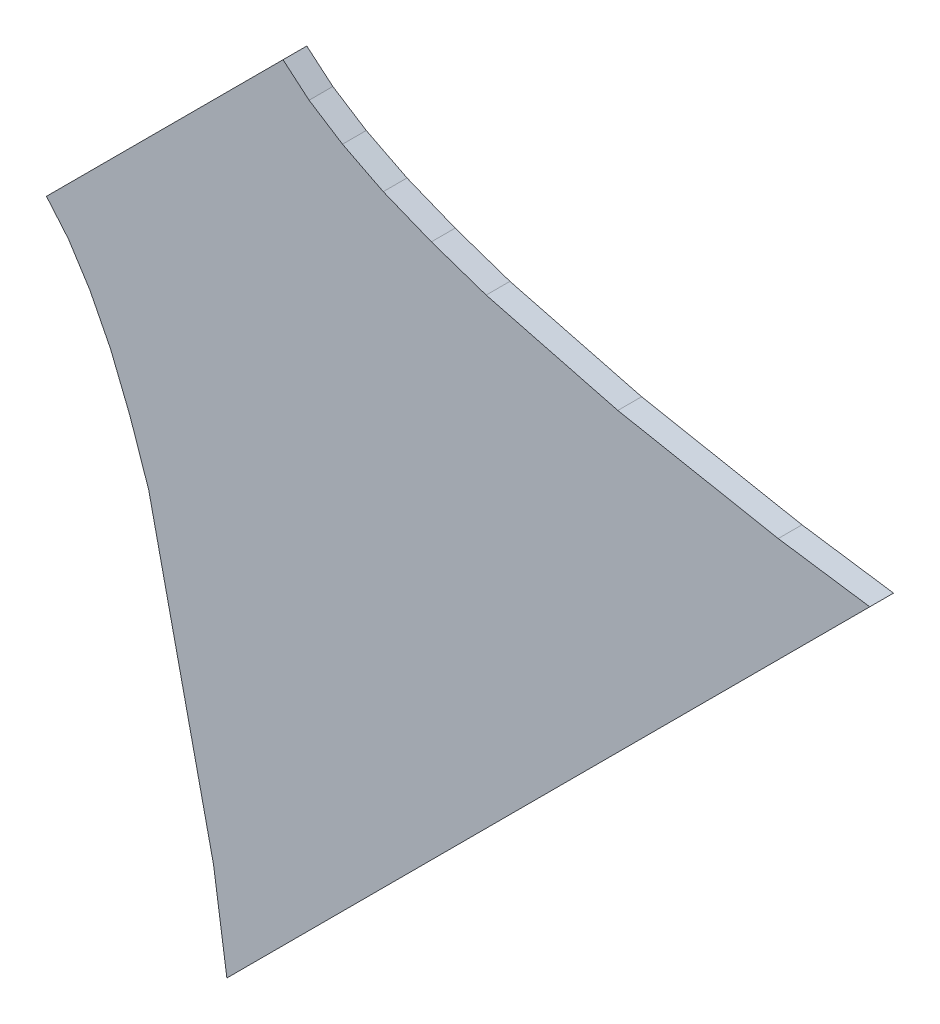
ISO-10303-21;
HEADER;
FILE_DESCRIPTION(('STEP AP214'),'2;1');
FILE_NAME('part.step','',(''),(''),'','','');
FILE_SCHEMA(('AUTOMOTIVE_DESIGN { 1 0 10303 214 1 1 1 1 }'));
ENDSEC;
DATA;
#1=APPLICATION_CONTEXT('core data for automotive mechanical design processes');
#2=APPLICATION_PROTOCOL_DEFINITION('international standard','automotive_design',2000,#1);
#3=PRODUCT_CONTEXT('',#1,'mechanical');
#4=PRODUCT('Part','Part','',(#3));
#5=PRODUCT_RELATED_PRODUCT_CATEGORY('part','',(#4));
#6=PRODUCT_DEFINITION_FORMATION('','',#4);
#7=PRODUCT_DEFINITION_CONTEXT('part definition',#1,'design');
#8=PRODUCT_DEFINITION('design','',#6,#7);
#9=PRODUCT_DEFINITION_SHAPE('','',#8);
#10=(LENGTH_UNIT() NAMED_UNIT(*) SI_UNIT(.MILLI.,.METRE.));
#11=(NAMED_UNIT(*) PLANE_ANGLE_UNIT() SI_UNIT($,.RADIAN.));
#12=(NAMED_UNIT(*) SI_UNIT($,.STERADIAN.) SOLID_ANGLE_UNIT());
#13=UNCERTAINTY_MEASURE_WITH_UNIT(LENGTH_MEASURE(1.E-05),#10,'distance_accuracy_value','');
#14=(GEOMETRIC_REPRESENTATION_CONTEXT(3) GLOBAL_UNCERTAINTY_ASSIGNED_CONTEXT((#13)) GLOBAL_UNIT_ASSIGNED_CONTEXT((#10,
#11,#12)) REPRESENTATION_CONTEXT('',''));
#15=CARTESIAN_POINT('',(0.,0.,0.));
#16=DIRECTION('',(0.,0.,1.));
#17=DIRECTION('',(1.,0.,0.));
#18=AXIS2_PLACEMENT_3D('',#15,#16,#17);
#19=CARTESIAN_POINT('',(44.7480010986328,54.757999420166,0.));
#20=DIRECTION('',(0.76339478271688,0.645932199012131,0.));
#21=DIRECTION('',(0.645932199012131,-0.76339478271688,0.));
#22=AXIS2_PLACEMENT_3D('',#19,#20,#21);
#23=PLANE('',#22);
#24=DIRECTION('',(0.645932199012131,-0.76339478271688,0.));
#25=VECTOR('',#24,1.);
#26=CARTESIAN_POINT('',(44.7480010986328,54.757999420166,0.03556));
#27=LINE('',#26,#25);
#28=CARTESIAN_POINT('',(44.7480010986328,54.757999420166,0.03556));
#29=VERTEX_POINT('',#28);
#30=CARTESIAN_POINT('',(44.7809982299805,54.7190017700195,0.03556));
#31=VERTEX_POINT('',#30);
#32=EDGE_CURVE('E11',#29,#31,#27,.T.);
#33=ORIENTED_EDGE('',*,*,#32,.F.);
#34=DIRECTION('',(0.,0.,1.));
#35=VECTOR('',#34,1.);
#36=CARTESIAN_POINT('',(44.7480010986328,54.757999420166,0.));
#37=LINE('',#36,#35);
#38=CARTESIAN_POINT('',(44.7480010986328,54.757999420166,0.));
#39=VERTEX_POINT('',#38);
#40=EDGE_CURVE('E24',#39,#29,#37,.T.);
#41=ORIENTED_EDGE('',*,*,#40,.F.);
#42=DIRECTION('',(0.645932199012131,-0.76339478271688,0.));
#43=VECTOR('',#42,1.);
#44=CARTESIAN_POINT('',(44.7480010986328,54.757999420166,0.));
#45=LINE('',#44,#43);
#46=CARTESIAN_POINT('',(44.7809982299805,54.7190017700195,0.));
#47=VERTEX_POINT('',#46);
#48=EDGE_CURVE('E154',#39,#47,#45,.T.);
#49=ORIENTED_EDGE('',*,*,#48,.T.);
#50=DIRECTION('',(0.,0.,1.));
#51=VECTOR('',#50,1.);
#52=CARTESIAN_POINT('',(44.7809982299805,54.7190017700195,0.));
#53=LINE('',#52,#51);
#54=EDGE_CURVE('E37',#47,#31,#53,.T.);
#55=ORIENTED_EDGE('',*,*,#54,.T.);
#56=EDGE_LOOP('',(#33,#41,#49,#55));
#57=FACE_BOUND('',#56,.T.);
#58=ADVANCED_FACE('F17',(#57),#23,.F.);
#59=CARTESIAN_POINT('',(44.7809982299805,54.7190017700195,0.));
#60=DIRECTION('',(0.842274901568336,0.539048226217331,0.));
#61=DIRECTION('',(0.539048226217331,-0.842274901568336,0.));
#62=AXIS2_PLACEMENT_3D('',#59,#60,#61);
#63=PLANE('',#62);
#64=DIRECTION('',(0.539048226217331,-0.842274901568336,0.));
#65=VECTOR('',#64,1.);
#66=CARTESIAN_POINT('',(44.7809982299805,54.7190017700195,0.03556));
#67=LINE('',#66,#65);
#68=CARTESIAN_POINT('',(44.8129997253418,54.6689987182617,0.03556));
#69=VERTEX_POINT('',#68);
#70=EDGE_CURVE('E266',#31,#69,#67,.T.);
#71=ORIENTED_EDGE('',*,*,#70,.F.);
#72=ORIENTED_EDGE('',*,*,#54,.F.);
#73=DIRECTION('',(0.539048226217331,-0.842274901568336,0.));
#74=VECTOR('',#73,1.);
#75=CARTESIAN_POINT('',(44.7809982299805,54.7190017700195,0.));
#76=LINE('',#75,#74);
#77=CARTESIAN_POINT('',(44.8129997253418,54.6689987182617,0.));
#78=VERTEX_POINT('',#77);
#79=EDGE_CURVE('E263',#47,#78,#76,.T.);
#80=ORIENTED_EDGE('',*,*,#79,.T.);
#81=DIRECTION('',(0.,0.,1.));
#82=VECTOR('',#81,1.);
#83=CARTESIAN_POINT('',(44.8129997253418,54.6689987182617,0.));
#84=LINE('',#83,#82);
#85=EDGE_CURVE('E261',#78,#69,#84,.T.);
#86=ORIENTED_EDGE('',*,*,#85,.T.);
#87=EDGE_LOOP('',(#71,#72,#80,#86));
#88=FACE_BOUND('',#87,.T.);
#89=ADVANCED_FACE('F274',(#88),#63,.F.);
#90=CARTESIAN_POINT('',(44.8129997253418,54.6689987182617,0.));
#91=DIRECTION('',(0.891464143342282,0.453091250340383,0.));
#92=DIRECTION('',(0.453091250340383,-0.891464143342282,0.));
#93=AXIS2_PLACEMENT_3D('',#90,#91,#92);
#94=PLANE('',#93);
#95=DIRECTION('',(0.453091250340383,-0.891464143342282,0.));
#96=VECTOR('',#95,1.);
#97=CARTESIAN_POINT('',(44.8129997253418,54.6689987182617,0.03556));
#98=LINE('',#97,#96);
#99=CARTESIAN_POINT('',(44.8440017700195,54.6080017089844,0.03556));
#100=VERTEX_POINT('',#99);
#101=EDGE_CURVE('E258',#69,#100,#98,.T.);
#102=ORIENTED_EDGE('',*,*,#101,.F.);
#103=ORIENTED_EDGE('',*,*,#85,.F.);
#104=DIRECTION('',(0.453091250340383,-0.891464143342282,0.));
#105=VECTOR('',#104,1.);
#106=CARTESIAN_POINT('',(44.8129997253418,54.6689987182617,0.));
#107=LINE('',#106,#105);
#108=CARTESIAN_POINT('',(44.8440017700195,54.6080017089844,0.));
#109=VERTEX_POINT('',#108);
#110=EDGE_CURVE('E255',#78,#109,#107,.T.);
#111=ORIENTED_EDGE('',*,*,#110,.T.);
#112=DIRECTION('',(0.,0.,1.));
#113=VECTOR('',#112,1.);
#114=CARTESIAN_POINT('',(44.8440017700195,54.6080017089844,0.));
#115=LINE('',#114,#113);
#116=EDGE_CURVE('E253',#109,#100,#115,.T.);
#117=ORIENTED_EDGE('',*,*,#116,.T.);
#118=EDGE_LOOP('',(#102,#103,#111,#117));
#119=FACE_BOUND('',#118,.T.);
#120=ADVANCED_FACE('F280',(#119),#94,.F.);
#121=CARTESIAN_POINT('',(44.8440017700195,54.6080017089844,0.));
#122=DIRECTION('',(0.927592874693312,0.373592637532109,0.));
#123=DIRECTION('',(0.373592637532109,-0.927592874693312,0.));
#124=AXIS2_PLACEMENT_3D('',#121,#122,#123);
#125=PLANE('',#124);
#126=DIRECTION('',(0.373592637532109,-0.927592874693312,0.));
#127=VECTOR('',#126,1.);
#128=CARTESIAN_POINT('',(44.8440017700195,54.6080017089844,0.03556));
#129=LINE('',#128,#127);
#130=CARTESIAN_POINT('',(44.8730010986328,54.5359992980957,0.03556));
#131=VERTEX_POINT('',#130);
#132=EDGE_CURVE('E250',#100,#131,#129,.T.);
#133=ORIENTED_EDGE('',*,*,#132,.F.);
#134=ORIENTED_EDGE('',*,*,#116,.F.);
#135=DIRECTION('',(0.373592637532109,-0.927592874693312,0.));
#136=VECTOR('',#135,1.);
#137=CARTESIAN_POINT('',(44.8440017700195,54.6080017089844,0.));
#138=LINE('',#137,#136);
#139=CARTESIAN_POINT('',(44.8730010986328,54.5359992980957,0.));
#140=VERTEX_POINT('',#139);
#141=EDGE_CURVE('E247',#109,#140,#138,.T.);
#142=ORIENTED_EDGE('',*,*,#141,.T.);
#143=DIRECTION('',(0.,0.,1.));
#144=VECTOR('',#143,1.);
#145=CARTESIAN_POINT('',(44.8730010986328,54.5359992980957,0.));
#146=LINE('',#145,#144);
#147=EDGE_CURVE('E245',#140,#131,#146,.T.);
#148=ORIENTED_EDGE('',*,*,#147,.T.);
#149=EDGE_LOOP('',(#133,#134,#142,#148));
#150=FACE_BOUND('',#149,.T.);
#151=ADVANCED_FACE('F282',(#150),#125,.F.);
#152=CARTESIAN_POINT('',(44.8730010986328,54.5359992980957,0.));
#153=DIRECTION('',(0.946351169524934,0.323140006713482,0.));
#154=DIRECTION('',(0.323140006713482,-0.946351169524934,0.));
#155=AXIS2_PLACEMENT_3D('',#152,#153,#154);
#156=PLANE('',#155);
#157=DIRECTION('',(0.323140006713482,-0.946351169524934,0.));
#158=VECTOR('',#157,1.);
#159=CARTESIAN_POINT('',(44.8730010986328,54.5359992980957,0.03556));
#160=LINE('',#159,#158);
#161=CARTESIAN_POINT('',(44.9010009765625,54.4539985656738,0.03556));
#162=VERTEX_POINT('',#161);
#163=EDGE_CURVE('E242',#131,#162,#160,.T.);
#164=ORIENTED_EDGE('',*,*,#163,.F.);
#165=ORIENTED_EDGE('',*,*,#147,.F.);
#166=DIRECTION('',(0.323140006713482,-0.946351169524934,0.));
#167=VECTOR('',#166,1.);
#168=CARTESIAN_POINT('',(44.8730010986328,54.5359992980957,0.));
#169=LINE('',#168,#167);
#170=CARTESIAN_POINT('',(44.9010009765625,54.4539985656738,0.));
#171=VERTEX_POINT('',#170);
#172=EDGE_CURVE('E239',#140,#171,#169,.T.);
#173=ORIENTED_EDGE('',*,*,#172,.T.);
#174=DIRECTION('',(0.,0.,1.));
#175=VECTOR('',#174,1.);
#176=CARTESIAN_POINT('',(44.9010009765625,54.4539985656738,0.));
#177=LINE('',#176,#175);
#178=EDGE_CURVE('E237',#171,#162,#177,.T.);
#179=ORIENTED_EDGE('',*,*,#178,.T.);
#180=EDGE_LOOP('',(#164,#165,#173,#179));
#181=FACE_BOUND('',#180,.T.);
#182=ADVANCED_FACE('F287',(#181),#156,.F.);
#183=CARTESIAN_POINT('',(44.9010009765625,54.4539985656738,0.));
#184=DIRECTION('',(0.976239566364474,0.21669404482935,0.));
#185=DIRECTION('',(0.21669404482935,-0.976239566364474,0.));
#186=AXIS2_PLACEMENT_3D('',#183,#184,#185);
#187=PLANE('',#186);
#188=DIRECTION('',(0.21669404482935,-0.976239566364474,0.));
#189=VECTOR('',#188,1.);
#190=CARTESIAN_POINT('',(44.9010009765625,54.4539985656738,0.03556));
#191=LINE('',#190,#189);
#192=CARTESIAN_POINT('',(44.9980010986328,54.0169982910156,0.03556));
#193=VERTEX_POINT('',#192);
#194=EDGE_CURVE('E234',#162,#193,#191,.T.);
#195=ORIENTED_EDGE('',*,*,#194,.F.);
#196=ORIENTED_EDGE('',*,*,#178,.F.);
#197=DIRECTION('',(0.21669404482935,-0.976239566364474,0.));
#198=VECTOR('',#197,1.);
#199=CARTESIAN_POINT('',(44.9010009765625,54.4539985656738,0.));
#200=LINE('',#199,#198);
#201=CARTESIAN_POINT('',(44.9980010986328,54.0169982910156,0.));
#202=VERTEX_POINT('',#201);
#203=EDGE_CURVE('E231',#171,#202,#200,.T.);
#204=ORIENTED_EDGE('',*,*,#203,.T.);
#205=DIRECTION('',(0.,0.,1.));
#206=VECTOR('',#205,1.);
#207=CARTESIAN_POINT('',(44.9980010986328,54.0169982910156,0.));
#208=LINE('',#207,#206);
#209=EDGE_CURVE('E229',#202,#193,#208,.T.);
#210=ORIENTED_EDGE('',*,*,#209,.T.);
#211=EDGE_LOOP('',(#195,#196,#204,#210));
#212=FACE_BOUND('',#211,.T.);
#213=ADVANCED_FACE('F290',(#212),#187,.F.);
#214=CARTESIAN_POINT('',(44.9980010986328,54.0169982910156,0.));
#215=DIRECTION('',(0.989510591874557,0.144460335622151,0.));
#216=DIRECTION('',(0.144460335622151,-0.989510591874557,0.));
#217=AXIS2_PLACEMENT_3D('',#214,#215,#216);
#218=PLANE('',#217);
#219=DIRECTION('',(0.144460335622151,-0.989510591874557,0.));
#220=VECTOR('',#219,1.);
#221=CARTESIAN_POINT('',(44.9980010986328,54.0169982910156,0.03556));
#222=LINE('',#221,#220);
#223=CARTESIAN_POINT('',(45.0180015563965,53.8800010681152,0.03556));
#224=VERTEX_POINT('',#223);
#225=EDGE_CURVE('E226',#193,#224,#222,.T.);
#226=ORIENTED_EDGE('',*,*,#225,.F.);
#227=ORIENTED_EDGE('',*,*,#209,.F.);
#228=DIRECTION('',(0.144460335622151,-0.989510591874557,0.));
#229=VECTOR('',#228,1.);
#230=CARTESIAN_POINT('',(44.9980010986328,54.0169982910156,0.));
#231=LINE('',#230,#229);
#232=CARTESIAN_POINT('',(45.0180015563965,53.8800010681152,0.));
#233=VERTEX_POINT('',#232);
#234=EDGE_CURVE('E223',#202,#233,#231,.T.);
#235=ORIENTED_EDGE('',*,*,#234,.T.);
#236=DIRECTION('',(0.,0.,1.));
#237=VECTOR('',#236,1.);
#238=CARTESIAN_POINT('',(45.0180015563965,53.8800010681152,0.));
#239=LINE('',#238,#237);
#240=EDGE_CURVE('E221',#233,#224,#239,.T.);
#241=ORIENTED_EDGE('',*,*,#240,.T.);
#242=EDGE_LOOP('',(#226,#227,#235,#241));
#243=FACE_BOUND('',#242,.T.);
#244=ADVANCED_FACE('F295',(#243),#218,.F.);
#245=CARTESIAN_POINT('',(45.0180015563965,53.8800010681152,0.));
#246=DIRECTION('',(-0.707106781186548,0.707106781186548,0.));
#247=DIRECTION('',(0.707106781186548,0.707106781186548,0.));
#248=AXIS2_PLACEMENT_3D('',#245,#246,#247);
#249=PLANE('',#248);
#250=DIRECTION('',(0.707106781186548,0.707106781186548,0.));
#251=VECTOR('',#250,1.);
#252=CARTESIAN_POINT('',(45.0180015563965,53.8800010681152,0.03556));
#253=LINE('',#252,#251);
#254=CARTESIAN_POINT('',(45.9799995422363,54.8419990539551,0.03556));
#255=VERTEX_POINT('',#254);
#256=EDGE_CURVE('E218',#224,#255,#253,.T.);
#257=ORIENTED_EDGE('',*,*,#256,.F.);
#258=ORIENTED_EDGE('',*,*,#240,.F.);
#259=DIRECTION('',(0.707106781186548,0.707106781186548,0.));
#260=VECTOR('',#259,1.);
#261=CARTESIAN_POINT('',(45.0180015563965,53.8800010681152,0.));
#262=LINE('',#261,#260);
#263=CARTESIAN_POINT('',(45.9799995422363,54.8419990539551,0.));
#264=VERTEX_POINT('',#263);
#265=EDGE_CURVE('E215',#233,#264,#262,.T.);
#266=ORIENTED_EDGE('',*,*,#265,.T.);
#267=DIRECTION('',(0.,0.,1.));
#268=VECTOR('',#267,1.);
#269=CARTESIAN_POINT('',(45.9799995422363,54.8419990539551,0.));
#270=LINE('',#269,#268);
#271=EDGE_CURVE('E213',#264,#255,#270,.T.);
#272=ORIENTED_EDGE('',*,*,#271,.T.);
#273=EDGE_LOOP('',(#257,#258,#266,#272));
#274=FACE_BOUND('',#273,.T.);
#275=ADVANCED_FACE('F298',(#274),#249,.F.);
#276=CARTESIAN_POINT('',(45.9799995422363,54.8419990539551,0.));
#277=DIRECTION('',(-0.144456397165095,-0.989511166848601,0.));
#278=DIRECTION('',(-0.989511166848601,0.144456397165095,0.));
#279=AXIS2_PLACEMENT_3D('',#276,#277,#278);
#280=PLANE('',#279);
#281=DIRECTION('',(-0.989511166848601,0.144456397165095,0.));
#282=VECTOR('',#281,1.);
#283=CARTESIAN_POINT('',(45.9799995422363,54.8419990539551,0.03556));
#284=LINE('',#283,#282);
#285=CARTESIAN_POINT('',(45.8429985046387,54.8619995117188,0.03556));
#286=VERTEX_POINT('',#285);
#287=EDGE_CURVE('E210',#255,#286,#284,.T.);
#288=ORIENTED_EDGE('',*,*,#287,.F.);
#289=ORIENTED_EDGE('',*,*,#271,.F.);
#290=DIRECTION('',(-0.989511166848601,0.144456397165095,0.));
#291=VECTOR('',#290,1.);
#292=CARTESIAN_POINT('',(45.9799995422363,54.8419990539551,0.));
#293=LINE('',#292,#291);
#294=CARTESIAN_POINT('',(45.8429985046387,54.8619995117188,0.));
#295=VERTEX_POINT('',#294);
#296=EDGE_CURVE('E207',#264,#295,#293,.T.);
#297=ORIENTED_EDGE('',*,*,#296,.T.);
#298=DIRECTION('',(0.,0.,1.));
#299=VECTOR('',#298,1.);
#300=CARTESIAN_POINT('',(45.8429985046387,54.8619995117188,0.));
#301=LINE('',#300,#299);
#302=EDGE_CURVE('E205',#295,#286,#301,.T.);
#303=ORIENTED_EDGE('',*,*,#302,.T.);
#304=EDGE_LOOP('',(#288,#289,#297,#303));
#305=FACE_BOUND('',#304,.T.);
#306=ADVANCED_FACE('F303',(#305),#280,.F.);
#307=CARTESIAN_POINT('',(45.8429985046387,54.8619995117188,0.));
#308=DIRECTION('',(-0.188247521686803,-0.982121617000042,0.));
#309=DIRECTION('',(-0.982121617000042,0.188247521686803,0.));
#310=AXIS2_PLACEMENT_3D('',#307,#308,#309);
#311=PLANE('',#310);
#312=DIRECTION('',(-0.982121617000042,0.188247521686803,0.));
#313=VECTOR('',#312,1.);
#314=CARTESIAN_POINT('',(45.8429985046387,54.8619995117188,0.03556));
#315=LINE('',#314,#313);
#316=CARTESIAN_POINT('',(45.6030006408691,54.9080009460449,0.03556));
#317=VERTEX_POINT('',#316);
#318=EDGE_CURVE('E202',#286,#317,#315,.T.);
#319=ORIENTED_EDGE('',*,*,#318,.F.);
#320=ORIENTED_EDGE('',*,*,#302,.F.);
#321=DIRECTION('',(-0.982121617000042,0.188247521686803,0.));
#322=VECTOR('',#321,1.);
#323=CARTESIAN_POINT('',(45.8429985046387,54.8619995117188,0.));
#324=LINE('',#323,#322);
#325=CARTESIAN_POINT('',(45.6030006408691,54.9080009460449,0.));
#326=VERTEX_POINT('',#325);
#327=EDGE_CURVE('E199',#295,#326,#324,.T.);
#328=ORIENTED_EDGE('',*,*,#327,.T.);
#329=DIRECTION('',(0.,0.,1.));
#330=VECTOR('',#329,1.);
#331=CARTESIAN_POINT('',(45.6030006408691,54.9080009460449,0.));
#332=LINE('',#331,#330);
#333=EDGE_CURVE('E197',#326,#317,#332,.T.);
#334=ORIENTED_EDGE('',*,*,#333,.T.);
#335=EDGE_LOOP('',(#319,#320,#328,#334));
#336=FACE_BOUND('',#335,.T.);
#337=ADVANCED_FACE('F306',(#336),#311,.F.);
#338=CARTESIAN_POINT('',(45.6030006408691,54.9080009460449,0.));
#339=DIRECTION('',(-0.250612141103949,-0.968087575961645,0.));
#340=DIRECTION('',(-0.968087575961645,0.250612141103949,0.));
#341=AXIS2_PLACEMENT_3D('',#338,#339,#340);
#342=PLANE('',#341);
#343=DIRECTION('',(-0.968087575961645,0.250612141103949,0.));
#344=VECTOR('',#343,1.);
#345=CARTESIAN_POINT('',(45.6030006408691,54.9080009460449,0.03556));
#346=LINE('',#345,#344);
#347=CARTESIAN_POINT('',(45.4059982299805,54.9589996337891,0.03556));
#348=VERTEX_POINT('',#347);
#349=EDGE_CURVE('E194',#317,#348,#346,.T.);
#350=ORIENTED_EDGE('',*,*,#349,.F.);
#351=ORIENTED_EDGE('',*,*,#333,.F.);
#352=DIRECTION('',(-0.968087575961645,0.250612141103949,0.));
#353=VECTOR('',#352,1.);
#354=CARTESIAN_POINT('',(45.6030006408691,54.9080009460449,0.));
#355=LINE('',#354,#353);
#356=CARTESIAN_POINT('',(45.4059982299805,54.9589996337891,0.));
#357=VERTEX_POINT('',#356);
#358=EDGE_CURVE('E191',#326,#357,#355,.T.);
#359=ORIENTED_EDGE('',*,*,#358,.T.);
#360=DIRECTION('',(0.,0.,1.));
#361=VECTOR('',#360,1.);
#362=CARTESIAN_POINT('',(45.4059982299805,54.9589996337891,0.));
#363=LINE('',#362,#361);
#364=EDGE_CURVE('E189',#357,#348,#363,.T.);
#365=ORIENTED_EDGE('',*,*,#364,.T.);
#366=EDGE_LOOP('',(#350,#351,#359,#365));
#367=FACE_BOUND('',#366,.T.);
#368=ADVANCED_FACE('F311',(#367),#342,.F.);
#369=CARTESIAN_POINT('',(45.4059982299805,54.9589996337891,0.));
#370=DIRECTION('',(-0.323153470113885,-0.946346572220429,0.));
#371=DIRECTION('',(-0.946346572220429,0.323153470113885,0.));
#372=AXIS2_PLACEMENT_3D('',#369,#370,#371);
#373=PLANE('',#372);
#374=DIRECTION('',(-0.946346572220429,0.323153470113884,0.));
#375=VECTOR('',#374,1.);
#376=CARTESIAN_POINT('',(45.4059982299805,54.9589996337891,0.03556));
#377=LINE('',#376,#375);
#378=CARTESIAN_POINT('',(45.3240013122559,54.9869995117188,0.03556));
#379=VERTEX_POINT('',#378);
#380=EDGE_CURVE('E186',#348,#379,#377,.T.);
#381=ORIENTED_EDGE('',*,*,#380,.F.);
#382=ORIENTED_EDGE('',*,*,#364,.F.);
#383=DIRECTION('',(-0.946346572220429,0.323153470113884,0.));
#384=VECTOR('',#383,1.);
#385=CARTESIAN_POINT('',(45.4059982299805,54.9589996337891,0.));
#386=LINE('',#385,#384);
#387=CARTESIAN_POINT('',(45.3240013122559,54.9869995117188,0.));
#388=VERTEX_POINT('',#387);
#389=EDGE_CURVE('E183',#357,#388,#386,.T.);
#390=ORIENTED_EDGE('',*,*,#389,.T.);
#391=DIRECTION('',(0.,0.,1.));
#392=VECTOR('',#391,1.);
#393=CARTESIAN_POINT('',(45.3240013122559,54.9869995117188,0.));
#394=LINE('',#393,#392);
#395=EDGE_CURVE('E181',#388,#379,#394,.T.);
#396=ORIENTED_EDGE('',*,*,#395,.T.);
#397=EDGE_LOOP('',(#381,#382,#390,#396));
#398=FACE_BOUND('',#397,.T.);
#399=ADVANCED_FACE('F314',(#398),#373,.F.);
#400=CARTESIAN_POINT('',(45.3240013122559,54.9869995117188,0.));
#401=DIRECTION('',(-0.373592637532109,-0.927592874693312,0.));
#402=DIRECTION('',(-0.927592874693312,0.373592637532109,0.));
#403=AXIS2_PLACEMENT_3D('',#400,#401,#402);
#404=PLANE('',#403);
#405=DIRECTION('',(-0.927592874693312,0.373592637532109,0.));
#406=VECTOR('',#405,1.);
#407=CARTESIAN_POINT('',(45.3240013122559,54.9869995117188,0.03556));
#408=LINE('',#407,#406);
#409=CARTESIAN_POINT('',(45.2519989013672,55.015998840332,0.03556));
#410=VERTEX_POINT('',#409);
#411=EDGE_CURVE('E178',#379,#410,#408,.T.);
#412=ORIENTED_EDGE('',*,*,#411,.F.);
#413=ORIENTED_EDGE('',*,*,#395,.F.);
#414=DIRECTION('',(-0.927592874693312,0.373592637532109,0.));
#415=VECTOR('',#414,1.);
#416=CARTESIAN_POINT('',(45.3240013122559,54.9869995117188,0.));
#417=LINE('',#416,#415);
#418=CARTESIAN_POINT('',(45.2519989013672,55.015998840332,0.));
#419=VERTEX_POINT('',#418);
#420=EDGE_CURVE('E175',#388,#419,#417,.T.);
#421=ORIENTED_EDGE('',*,*,#420,.T.);
#422=DIRECTION('',(0.,0.,1.));
#423=VECTOR('',#422,1.);
#424=CARTESIAN_POINT('',(45.2519989013672,55.015998840332,0.));
#425=LINE('',#424,#423);
#426=EDGE_CURVE('E173',#419,#410,#425,.T.);
#427=ORIENTED_EDGE('',*,*,#426,.T.);
#428=EDGE_LOOP('',(#412,#413,#421,#427));
#429=FACE_BOUND('',#428,.T.);
#430=ADVANCED_FACE('F319',(#429),#404,.F.);
#431=CARTESIAN_POINT('',(45.2519989013672,55.015998840332,0.));
#432=DIRECTION('',(-0.453091250340383,-0.891464143342282,0.));
#433=DIRECTION('',(-0.891464143342282,0.453091250340383,0.));
#434=AXIS2_PLACEMENT_3D('',#431,#432,#433);
#435=PLANE('',#434);
#436=DIRECTION('',(-0.891464143342282,0.453091250340383,0.));
#437=VECTOR('',#436,1.);
#438=CARTESIAN_POINT('',(45.2519989013672,55.015998840332,0.03556));
#439=LINE('',#438,#437);
#440=CARTESIAN_POINT('',(45.1910018920898,55.0470008850098,0.03556));
#441=VERTEX_POINT('',#440);
#442=EDGE_CURVE('E170',#410,#441,#439,.T.);
#443=ORIENTED_EDGE('',*,*,#442,.F.);
#444=ORIENTED_EDGE('',*,*,#426,.F.);
#445=DIRECTION('',(-0.891464143342282,0.453091250340383,0.));
#446=VECTOR('',#445,1.);
#447=CARTESIAN_POINT('',(45.2519989013672,55.015998840332,0.));
#448=LINE('',#447,#446);
#449=CARTESIAN_POINT('',(45.1910018920898,55.0470008850098,0.));
#450=VERTEX_POINT('',#449);
#451=EDGE_CURVE('E167',#419,#450,#448,.T.);
#452=ORIENTED_EDGE('',*,*,#451,.T.);
#453=DIRECTION('',(0.,0.,1.));
#454=VECTOR('',#453,1.);
#455=CARTESIAN_POINT('',(45.1910018920898,55.0470008850098,0.));
#456=LINE('',#455,#454);
#457=EDGE_CURVE('E165',#450,#441,#456,.T.);
#458=ORIENTED_EDGE('',*,*,#457,.T.);
#459=EDGE_LOOP('',(#443,#444,#452,#458));
#460=FACE_BOUND('',#459,.T.);
#461=ADVANCED_FACE('F322',(#460),#435,.F.);
#462=CARTESIAN_POINT('',(45.1910018920899,55.0470008850098,0.));
#463=DIRECTION('',(-0.539002638514335,-0.842304075541954,0.));
#464=DIRECTION('',(-0.842304075541954,0.539002638514335,0.));
#465=AXIS2_PLACEMENT_3D('',#462,#463,#464);
#466=PLANE('',#465);
#467=DIRECTION('',(-0.842304075541954,0.539002638514335,0.));
#468=VECTOR('',#467,1.);
#469=CARTESIAN_POINT('',(45.1910018920898,55.0470008850098,0.03556));
#470=LINE('',#469,#468);
#471=CARTESIAN_POINT('',(45.140998840332,55.0789985656738,0.03556));
#472=VERTEX_POINT('',#471);
#473=EDGE_CURVE('E162',#441,#472,#470,.T.);
#474=ORIENTED_EDGE('',*,*,#473,.F.);
#475=ORIENTED_EDGE('',*,*,#457,.F.);
#476=DIRECTION('',(-0.842304075541954,0.539002638514335,0.));
#477=VECTOR('',#476,1.);
#478=CARTESIAN_POINT('',(45.1910018920898,55.0470008850098,0.));
#479=LINE('',#478,#477);
#480=CARTESIAN_POINT('',(45.140998840332,55.0789985656738,0.));
#481=VERTEX_POINT('',#480);
#482=EDGE_CURVE('E160',#450,#481,#479,.T.);
#483=ORIENTED_EDGE('',*,*,#482,.T.);
#484=DIRECTION('',(0.,0.,1.));
#485=VECTOR('',#484,1.);
#486=CARTESIAN_POINT('',(45.140998840332,55.0789985656738,0.));
#487=LINE('',#486,#485);
#488=EDGE_CURVE('E145',#481,#472,#487,.T.);
#489=ORIENTED_EDGE('',*,*,#488,.T.);
#490=EDGE_LOOP('',(#474,#475,#483,#489));
#491=FACE_BOUND('',#490,.T.);
#492=ADVANCED_FACE('F325',(#491),#466,.F.);
#493=CARTESIAN_POINT('',(45.140998840332,55.0789985656738,0.));
#494=DIRECTION('',(-0.645975713891104,-0.763357961288725,0.));
#495=DIRECTION('',(-0.763357961288725,0.645975713891104,0.));
#496=AXIS2_PLACEMENT_3D('',#493,#494,#495);
#497=PLANE('',#496);
#498=DIRECTION('',(-0.763357961288725,0.645975713891104,0.));
#499=VECTOR('',#498,1.);
#500=CARTESIAN_POINT('',(45.140998840332,55.0789985656738,0.03556));
#501=LINE('',#500,#499);
#502=CARTESIAN_POINT('',(45.1020011901855,55.1119995117188,0.03556));
#503=VERTEX_POINT('',#502);
#504=EDGE_CURVE('E149',#472,#503,#501,.T.);
#505=ORIENTED_EDGE('',*,*,#504,.F.);
#506=ORIENTED_EDGE('',*,*,#488,.F.);
#507=DIRECTION('',(-0.763357961288725,0.645975713891104,0.));
#508=VECTOR('',#507,1.);
#509=CARTESIAN_POINT('',(45.140998840332,55.0789985656738,0.));
#510=LINE('',#509,#508);
#511=CARTESIAN_POINT('',(45.1020011901855,55.1119995117188,0.));
#512=VERTEX_POINT('',#511);
#513=EDGE_CURVE('E141',#481,#512,#510,.T.);
#514=ORIENTED_EDGE('',*,*,#513,.T.);
#515=DIRECTION('',(0.,0.,1.));
#516=VECTOR('',#515,1.);
#517=CARTESIAN_POINT('',(45.1020011901855,55.1119995117188,0.));
#518=LINE('',#517,#516);
#519=EDGE_CURVE('E131',#512,#503,#518,.T.);
#520=ORIENTED_EDGE('',*,*,#519,.T.);
#521=EDGE_LOOP('',(#505,#506,#514,#520));
#522=FACE_BOUND('',#521,.T.);
#523=ADVANCED_FACE('F144',(#522),#497,.F.);
#524=CARTESIAN_POINT('',(45.1020011901855,55.1119995117188,0.));
#525=DIRECTION('',(0.707106781186548,-0.707106781186548,0.));
#526=DIRECTION('',(-0.707106781186548,-0.707106781186548,0.));
#527=AXIS2_PLACEMENT_3D('',#524,#525,#526);
#528=PLANE('',#527);
#529=DIRECTION('',(-0.707106781186548,-0.707106781186548,0.));
#530=VECTOR('',#529,1.);
#531=CARTESIAN_POINT('',(45.1020011901855,55.1119995117188,0.03556));
#532=LINE('',#531,#530);
#533=EDGE_CURVE('E137',#503,#29,#532,.T.);
#534=ORIENTED_EDGE('',*,*,#533,.F.);
#535=ORIENTED_EDGE('',*,*,#519,.F.);
#536=DIRECTION('',(-0.707106781186548,-0.707106781186548,0.));
#537=VECTOR('',#536,1.);
#538=CARTESIAN_POINT('',(45.1020011901855,55.1119995117188,0.));
#539=LINE('',#538,#537);
#540=EDGE_CURVE('E135',#512,#39,#539,.T.);
#541=ORIENTED_EDGE('',*,*,#540,.T.);
#542=ORIENTED_EDGE('',*,*,#40,.T.);
#543=EDGE_LOOP('',(#534,#535,#541,#542));
#544=FACE_BOUND('',#543,.T.);
#545=ADVANCED_FACE('F133',(#544),#528,.F.);
#546=CARTESIAN_POINT('',(44.7480010986328,54.757999420166,0.));
#547=DIRECTION('',(0.,0.,1.));
#548=DIRECTION('',(1.,0.,0.));
#549=AXIS2_PLACEMENT_3D('',#546,#547,#548);
#550=PLANE('',#549);
#551=ORIENTED_EDGE('',*,*,#540,.F.);
#552=ORIENTED_EDGE('',*,*,#513,.F.);
#553=ORIENTED_EDGE('',*,*,#482,.F.);
#554=ORIENTED_EDGE('',*,*,#451,.F.);
#555=ORIENTED_EDGE('',*,*,#420,.F.);
#556=ORIENTED_EDGE('',*,*,#389,.F.);
#557=ORIENTED_EDGE('',*,*,#358,.F.);
#558=ORIENTED_EDGE('',*,*,#327,.F.);
#559=ORIENTED_EDGE('',*,*,#296,.F.);
#560=ORIENTED_EDGE('',*,*,#265,.F.);
#561=ORIENTED_EDGE('',*,*,#234,.F.);
#562=ORIENTED_EDGE('',*,*,#203,.F.);
#563=ORIENTED_EDGE('',*,*,#172,.F.);
#564=ORIENTED_EDGE('',*,*,#141,.F.);
#565=ORIENTED_EDGE('',*,*,#110,.F.);
#566=ORIENTED_EDGE('',*,*,#79,.F.);
#567=ORIENTED_EDGE('',*,*,#48,.F.);
#568=EDGE_LOOP('',(#551,#552,#553,#554,#555,#556,#557,#558,#559,#560,#561,#562,#563,#564,#565,
#566,#567));
#569=FACE_BOUND('',#568,.T.);
#570=ADVANCED_FACE('F152',(#569),#550,.F.);
#571=CARTESIAN_POINT('',(44.7480010986328,54.757999420166,0.03556));
#572=DIRECTION('',(0.,0.,1.));
#573=DIRECTION('',(1.,0.,0.));
#574=AXIS2_PLACEMENT_3D('',#571,#572,#573);
#575=PLANE('',#574);
#576=ORIENTED_EDGE('',*,*,#32,.T.);
#577=ORIENTED_EDGE('',*,*,#70,.T.);
#578=ORIENTED_EDGE('',*,*,#101,.T.);
#579=ORIENTED_EDGE('',*,*,#132,.T.);
#580=ORIENTED_EDGE('',*,*,#163,.T.);
#581=ORIENTED_EDGE('',*,*,#194,.T.);
#582=ORIENTED_EDGE('',*,*,#225,.T.);
#583=ORIENTED_EDGE('',*,*,#256,.T.);
#584=ORIENTED_EDGE('',*,*,#287,.T.);
#585=ORIENTED_EDGE('',*,*,#318,.T.);
#586=ORIENTED_EDGE('',*,*,#349,.T.);
#587=ORIENTED_EDGE('',*,*,#380,.T.);
#588=ORIENTED_EDGE('',*,*,#411,.T.);
#589=ORIENTED_EDGE('',*,*,#442,.T.);
#590=ORIENTED_EDGE('',*,*,#473,.T.);
#591=ORIENTED_EDGE('',*,*,#504,.T.);
#592=ORIENTED_EDGE('',*,*,#533,.T.);
#593=EDGE_LOOP('',(#576,#577,#578,#579,#580,#581,#582,#583,#584,#585,#586,#587,#588,#589,#590,
#591,#592));
#594=FACE_BOUND('',#593,.T.);
#595=ADVANCED_FACE('F277',(#594),#575,.T.);
#596=CLOSED_SHELL('',(#58,#89,#120,#151,#182,#213,#244,#275,#306,#337,#368,#399,#430,#461,#492,
#523,#545,#570,#595));
#597=MANIFOLD_SOLID_BREP('B1',#596);
#598=ADVANCED_BREP_SHAPE_REPRESENTATION('',(#18,#597),#14);
#599=SHAPE_DEFINITION_REPRESENTATION(#9,#598);
ENDSEC;
END-ISO-10303-21;
